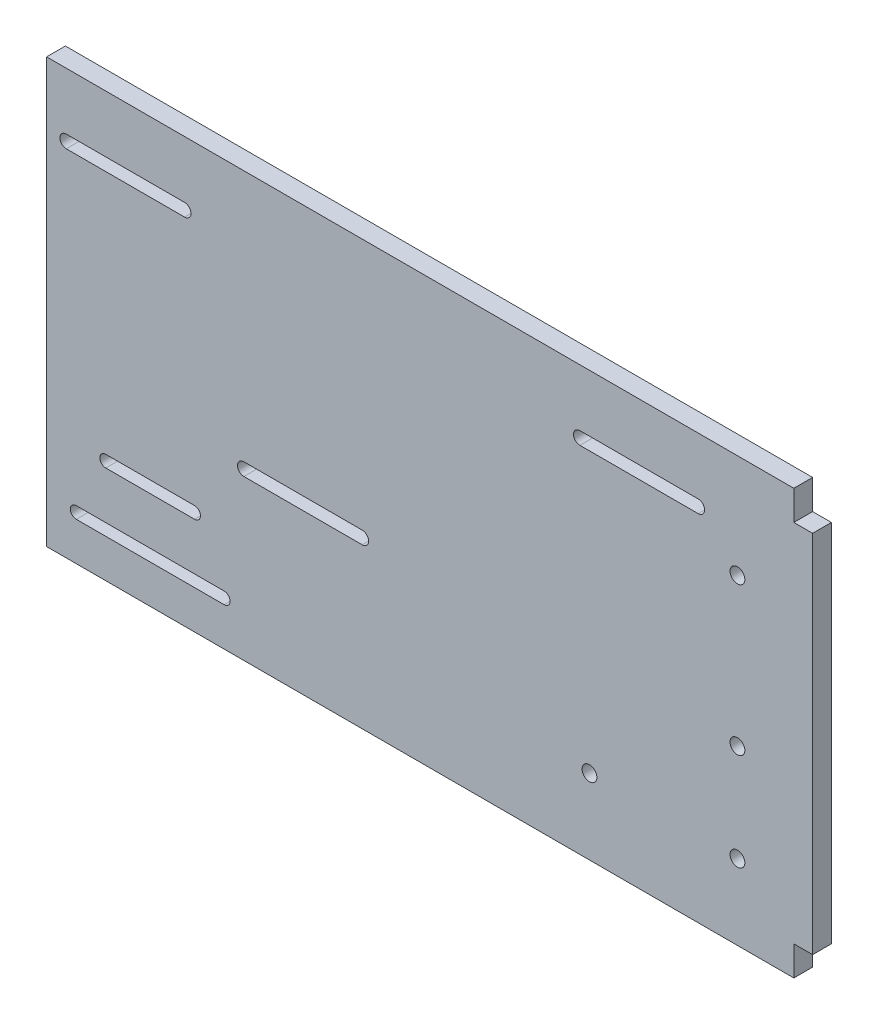
ISO-10303-21;
HEADER;
FILE_DESCRIPTION(('STEP AP214'),'2;1');
FILE_NAME('part.step','',(''),(''),'','','');
FILE_SCHEMA(('AUTOMOTIVE_DESIGN { 1 0 10303 214 1 1 1 1 }'));
ENDSEC;
DATA;
#1=APPLICATION_CONTEXT('core data for automotive mechanical design processes');
#2=APPLICATION_PROTOCOL_DEFINITION('international standard','automotive_design',2000,#1);
#3=PRODUCT_CONTEXT('',#1,'mechanical');
#4=PRODUCT('Part','Part','',(#3));
#5=PRODUCT_RELATED_PRODUCT_CATEGORY('part','',(#4));
#6=PRODUCT_DEFINITION_FORMATION('','',#4);
#7=PRODUCT_DEFINITION_CONTEXT('part definition',#1,'design');
#8=PRODUCT_DEFINITION('design','',#6,#7);
#9=PRODUCT_DEFINITION_SHAPE('','',#8);
#10=(LENGTH_UNIT() NAMED_UNIT(*) SI_UNIT(.MILLI.,.METRE.));
#11=(NAMED_UNIT(*) PLANE_ANGLE_UNIT() SI_UNIT($,.RADIAN.));
#12=(NAMED_UNIT(*) SI_UNIT($,.STERADIAN.) SOLID_ANGLE_UNIT());
#13=UNCERTAINTY_MEASURE_WITH_UNIT(LENGTH_MEASURE(1.E-05),#10,'distance_accuracy_value','');
#14=(GEOMETRIC_REPRESENTATION_CONTEXT(3) GLOBAL_UNCERTAINTY_ASSIGNED_CONTEXT((#13)) GLOBAL_UNIT_ASSIGNED_CONTEXT((#10,
#11,#12)) REPRESENTATION_CONTEXT('',''));
#15=CARTESIAN_POINT('',(0.,0.,0.));
#16=DIRECTION('',(0.,0.,1.));
#17=DIRECTION('',(1.,0.,0.));
#18=AXIS2_PLACEMENT_3D('',#15,#16,#17);
#19=CARTESIAN_POINT('',(0.,0.,6.35));
#20=DIRECTION('',(0.,0.,-1.));
#21=DIRECTION('',(-1.,0.,0.));
#22=AXIS2_PLACEMENT_3D('',#19,#20,#21);
#23=PLANE('',#22);
#24=CARTESIAN_POINT('',(12.0916813878954,-66.3543128520775,6.35));
#25=DIRECTION('',(0.,0.,1.));
#26=DIRECTION('',(-1.,0.,0.));
#27=AXIS2_PLACEMENT_3D('',#24,#25,#26);
#28=CIRCLE('',#27,1.99999999999999);
#29=CARTESIAN_POINT('',(12.0916813878954,-64.3543128520775,6.35));
#30=VERTEX_POINT('',#29);
#31=CARTESIAN_POINT('',(12.0916813878954,-68.3543128520775,6.35));
#32=VERTEX_POINT('',#31);
#33=EDGE_CURVE('E273',#30,#32,#28,.T.);
#34=ORIENTED_EDGE('',*,*,#33,.F.);
#35=DIRECTION('',(-1.,0.,0.));
#36=VECTOR('',#35,1.);
#37=CARTESIAN_POINT('',(12.0916813878954,-64.3543128520775,6.35));
#38=LINE('',#37,#36);
#39=CARTESIAN_POINT('',(42.0916813878954,-64.3543128520775,6.35));
#40=VERTEX_POINT('',#39);
#41=EDGE_CURVE('E284',#40,#30,#38,.T.);
#42=ORIENTED_EDGE('',*,*,#41,.F.);
#43=CARTESIAN_POINT('',(42.0916813878954,-66.3543128520775,6.35));
#44=DIRECTION('',(0.,0.,1.));
#45=DIRECTION('',(1.,0.,0.));
#46=AXIS2_PLACEMENT_3D('',#43,#44,#45);
#47=CIRCLE('',#46,1.99999999999999);
#48=CARTESIAN_POINT('',(42.0916813878954,-68.3543128520775,6.35));
#49=VERTEX_POINT('',#48);
#50=EDGE_CURVE('E280',#49,#40,#47,.T.);
#51=ORIENTED_EDGE('',*,*,#50,.F.);
#52=DIRECTION('',(1.,0.,0.));
#53=VECTOR('',#52,1.);
#54=CARTESIAN_POINT('',(12.0916813878954,-68.3543128520775,6.35));
#55=LINE('',#54,#53);
#56=EDGE_CURVE('E276',#32,#49,#55,.T.);
#57=ORIENTED_EDGE('',*,*,#56,.F.);
#58=EDGE_LOOP('',(#34,#42,#51,#57));
#59=FACE_BOUND('',#58,.T.);
#60=CARTESIAN_POINT('',(225.534917863481,6.96266581231087,6.35));
#61=DIRECTION('',(0.,0.,1.));
#62=DIRECTION('',(1.,0.,0.));
#63=AXIS2_PLACEMENT_3D('',#60,#61,#62);
#64=CIRCLE('',#63,2.5);
#65=CARTESIAN_POINT('',(228.034917863481,6.96266581231087,6.35));
#66=VERTEX_POINT('',#65);
#67=EDGE_CURVE('E375',#66,#66,#64,.T.);
#68=ORIENTED_EDGE('',*,*,#67,.F.);
#69=EDGE_LOOP('',(#68));
#70=FACE_BOUND('',#69,.T.);
#71=CARTESIAN_POINT('',(58.7485992030947,-45.3543128520775,6.35));
#72=DIRECTION('',(0.,0.,1.));
#73=DIRECTION('',(1.,0.,0.));
#74=AXIS2_PLACEMENT_3D('',#71,#72,#73);
#75=CIRCLE('',#74,2.15);
#76=CARTESIAN_POINT('',(58.7485992030947,-43.2043128520775,6.35));
#77=VERTEX_POINT('',#76);
#78=CARTESIAN_POINT('',(58.7485992030947,-47.5043128520775,6.35));
#79=VERTEX_POINT('',#78);
#80=EDGE_CURVE('E383',#77,#79,#75,.T.);
#81=ORIENTED_EDGE('',*,*,#80,.F.);
#82=DIRECTION('',(-1.,0.,0.));
#83=VECTOR('',#82,1.);
#84=CARTESIAN_POINT('',(58.7485992030947,-43.2043128520775,6.35));
#85=LINE('',#84,#83);
#86=CARTESIAN_POINT('',(98.7485992030947,-43.2043128520775,6.35));
#87=VERTEX_POINT('',#86);
#88=EDGE_CURVE('E394',#87,#77,#85,.T.);
#89=ORIENTED_EDGE('',*,*,#88,.F.);
#90=CARTESIAN_POINT('',(98.7485992030947,-45.3543128520775,6.35));
#91=DIRECTION('',(0.,0.,1.));
#92=DIRECTION('',(-1.,0.,0.));
#93=AXIS2_PLACEMENT_3D('',#90,#91,#92);
#94=CIRCLE('',#93,2.15);
#95=CARTESIAN_POINT('',(98.7485992030947,-47.5043128520775,6.35));
#96=VERTEX_POINT('',#95);
#97=EDGE_CURVE('E390',#96,#87,#94,.T.);
#98=ORIENTED_EDGE('',*,*,#97,.F.);
#99=DIRECTION('',(1.,0.,0.));
#100=VECTOR('',#99,1.);
#101=CARTESIAN_POINT('',(58.7485992030947,-47.5043128520775,6.35));
#102=LINE('',#101,#100);
#103=EDGE_CURVE('E386',#79,#96,#102,.T.);
#104=ORIENTED_EDGE('',*,*,#103,.F.);
#105=EDGE_LOOP('',(#81,#89,#98,#104));
#106=FACE_BOUND('',#105,.T.);
#107=CARTESIAN_POINT('',(225.534917863481,-43.0373341876891,6.35));
#108=DIRECTION('',(0.,0.,1.));
#109=DIRECTION('',(1.,0.,0.));
#110=AXIS2_PLACEMENT_3D('',#107,#108,#109);
#111=CIRCLE('',#110,2.5);
#112=CARTESIAN_POINT('',(228.034917863481,-43.0373341876891,6.35));
#113=VERTEX_POINT('',#112);
#114=EDGE_CURVE('E469',#113,#113,#111,.T.);
#115=ORIENTED_EDGE('',*,*,#114,.F.);
#116=EDGE_LOOP('',(#115));
#117=FACE_BOUND('',#116,.T.);
#118=DIRECTION('',(0.,-1.,0.));
#119=VECTOR('',#118,1.);
#120=CARTESIAN_POINT('',(-7.9083186121046,41.9626658123108,6.35));
#121=LINE('',#120,#119);
#122=CARTESIAN_POINT('',(-7.9083186121046,41.9626658123108,6.35));
#123=VERTEX_POINT('',#122);
#124=CARTESIAN_POINT('',(-7.90831861210459,-101.354312852078,6.35));
#125=VERTEX_POINT('',#124);
#126=EDGE_CURVE('E477',#123,#125,#121,.T.);
#127=ORIENTED_EDGE('',*,*,#126,.T.);
#128=DIRECTION('',(1.,0.,0.));
#129=VECTOR('',#128,1.);
#130=CARTESIAN_POINT('',(244.584917863481,-101.354312852078,6.35));
#131=LINE('',#130,#129);
#132=CARTESIAN_POINT('',(244.584917863481,-101.354312852078,6.35));
#133=VERTEX_POINT('',#132);
#134=EDGE_CURVE('E481',#125,#133,#131,.T.);
#135=ORIENTED_EDGE('',*,*,#134,.T.);
#136=DIRECTION('',(0.,1.,0.));
#137=VECTOR('',#136,1.);
#138=CARTESIAN_POINT('',(244.584917863481,-101.354312852078,6.35));
#139=LINE('',#138,#137);
#140=CARTESIAN_POINT('',(244.584917863481,-91.3543128520775,6.35));
#141=VERTEX_POINT('',#140);
#142=EDGE_CURVE('E485',#133,#141,#139,.T.);
#143=ORIENTED_EDGE('',*,*,#142,.T.);
#144=DIRECTION('',(1.,0.,0.));
#145=VECTOR('',#144,1.);
#146=CARTESIAN_POINT('',(250.934917863481,-91.3543128520775,6.35));
#147=LINE('',#146,#145);
#148=CARTESIAN_POINT('',(250.934917863481,-91.3543128520775,6.35));
#149=VERTEX_POINT('',#148);
#150=EDGE_CURVE('E488',#141,#149,#147,.T.);
#151=ORIENTED_EDGE('',*,*,#150,.T.);
#152=DIRECTION('',(0.,1.,0.));
#153=VECTOR('',#152,1.);
#154=CARTESIAN_POINT('',(250.934917863481,31.9626658123109,6.35));
#155=LINE('',#154,#153);
#156=CARTESIAN_POINT('',(250.934917863481,31.9626658123109,6.35));
#157=VERTEX_POINT('',#156);
#158=EDGE_CURVE('E491',#149,#157,#155,.T.);
#159=ORIENTED_EDGE('',*,*,#158,.T.);
#160=DIRECTION('',(-1.,0.,0.));
#161=VECTOR('',#160,1.);
#162=CARTESIAN_POINT('',(250.934917863481,31.9626658123109,6.35));
#163=LINE('',#162,#161);
#164=CARTESIAN_POINT('',(244.584917863481,31.9626658123109,6.35));
#165=VERTEX_POINT('',#164);
#166=EDGE_CURVE('E494',#157,#165,#163,.T.);
#167=ORIENTED_EDGE('',*,*,#166,.T.);
#168=DIRECTION('',(0.,1.,0.));
#169=VECTOR('',#168,1.);
#170=CARTESIAN_POINT('',(244.584917863481,41.9626658123109,6.35));
#171=LINE('',#170,#169);
#172=CARTESIAN_POINT('',(244.584917863481,41.9626658123109,6.35));
#173=VERTEX_POINT('',#172);
#174=EDGE_CURVE('E497',#165,#173,#171,.T.);
#175=ORIENTED_EDGE('',*,*,#174,.T.);
#176=DIRECTION('',(-1.,0.,0.));
#177=VECTOR('',#176,1.);
#178=CARTESIAN_POINT('',(244.584917863481,41.9626658123109,6.35));
#179=LINE('',#178,#177);
#180=EDGE_CURVE('E500',#173,#123,#179,.T.);
#181=ORIENTED_EDGE('',*,*,#180,.T.);
#182=EDGE_LOOP('',(#127,#135,#143,#151,#159,#167,#175,#181));
#183=FACE_BOUND('',#182,.T.);
#184=CARTESIAN_POINT('',(-1.26140079691419,20.5356871479202,6.35));
#185=DIRECTION('',(0.,0.,1.));
#186=DIRECTION('',(1.,0.,0.));
#187=AXIS2_PLACEMENT_3D('',#184,#185,#186);
#188=CIRCLE('',#187,2.15);
#189=CARTESIAN_POINT('',(-1.26140079691419,22.6856871479202,6.35));
#190=VERTEX_POINT('',#189);
#191=CARTESIAN_POINT('',(-1.26140079691419,18.3856871479202,6.35));
#192=VERTEX_POINT('',#191);
#193=EDGE_CURVE('E426',#190,#192,#188,.T.);
#194=ORIENTED_EDGE('',*,*,#193,.F.);
#195=DIRECTION('',(-1.,0.,0.));
#196=VECTOR('',#195,1.);
#197=CARTESIAN_POINT('',(-1.26140079691419,22.6856871479202,6.35));
#198=LINE('',#197,#196);
#199=CARTESIAN_POINT('',(38.7385992030858,22.6856871479202,6.35));
#200=VERTEX_POINT('',#199);
#201=EDGE_CURVE('E437',#200,#190,#198,.T.);
#202=ORIENTED_EDGE('',*,*,#201,.F.);
#203=CARTESIAN_POINT('',(38.7385992030858,20.5356871479202,6.35));
#204=DIRECTION('',(0.,0.,1.));
#205=DIRECTION('',(-1.,0.,0.));
#206=AXIS2_PLACEMENT_3D('',#203,#204,#205);
#207=CIRCLE('',#206,2.15);
#208=CARTESIAN_POINT('',(38.7385992030858,18.3856871479202,6.35));
#209=VERTEX_POINT('',#208);
#210=EDGE_CURVE('E433',#209,#200,#207,.T.);
#211=ORIENTED_EDGE('',*,*,#210,.F.);
#212=DIRECTION('',(1.,0.,0.));
#213=VECTOR('',#212,1.);
#214=CARTESIAN_POINT('',(-1.26140079691419,18.3856871479202,6.35));
#215=LINE('',#214,#213);
#216=EDGE_CURVE('E429',#192,#209,#215,.T.);
#217=ORIENTED_EDGE('',*,*,#216,.F.);
#218=EDGE_LOOP('',(#194,#202,#211,#217));
#219=FACE_BOUND('',#218,.T.);
#220=CARTESIAN_POINT('',(172.288599203087,20.5356871479202,6.35));
#221=DIRECTION('',(0.,0.,1.));
#222=DIRECTION('',(1.,0.,0.));
#223=AXIS2_PLACEMENT_3D('',#220,#221,#222);
#224=CIRCLE('',#223,2.15000000000002);
#225=CARTESIAN_POINT('',(172.288599203087,22.6856871479202,6.35));
#226=VERTEX_POINT('',#225);
#227=CARTESIAN_POINT('',(172.288599203087,18.3856871479202,6.35));
#228=VERTEX_POINT('',#227);
#229=EDGE_CURVE('E332',#226,#228,#224,.T.);
#230=ORIENTED_EDGE('',*,*,#229,.F.);
#231=DIRECTION('',(-1.,0.,0.));
#232=VECTOR('',#231,1.);
#233=CARTESIAN_POINT('',(172.288599203087,22.6856871479202,6.35));
#234=LINE('',#233,#232);
#235=CARTESIAN_POINT('',(212.288599203087,22.6856871479202,6.35));
#236=VERTEX_POINT('',#235);
#237=EDGE_CURVE('E343',#236,#226,#234,.T.);
#238=ORIENTED_EDGE('',*,*,#237,.F.);
#239=CARTESIAN_POINT('',(212.288599203087,20.5356871479202,6.35));
#240=DIRECTION('',(0.,0.,1.));
#241=DIRECTION('',(-1.,0.,0.));
#242=AXIS2_PLACEMENT_3D('',#239,#240,#241);
#243=CIRCLE('',#242,2.15000000000002);
#244=CARTESIAN_POINT('',(212.288599203087,18.3856871479202,6.35));
#245=VERTEX_POINT('',#244);
#246=EDGE_CURVE('E339',#245,#236,#243,.T.);
#247=ORIENTED_EDGE('',*,*,#246,.F.);
#248=DIRECTION('',(1.,0.,0.));
#249=VECTOR('',#248,1.);
#250=CARTESIAN_POINT('',(172.288599203087,18.3856871479202,6.35));
#251=LINE('',#250,#249);
#252=EDGE_CURVE('E335',#228,#245,#251,.T.);
#253=ORIENTED_EDGE('',*,*,#252,.F.);
#254=EDGE_LOOP('',(#230,#238,#247,#253));
#255=FACE_BOUND('',#254,.T.);
#256=CARTESIAN_POINT('',(225.534917863481,-75.9543128520775,6.35));
#257=DIRECTION('',(0.,0.,1.));
#258=DIRECTION('',(1.,0.,0.));
#259=AXIS2_PLACEMENT_3D('',#256,#257,#258);
#260=CIRCLE('',#259,2.5);
#261=CARTESIAN_POINT('',(228.034917863481,-75.9543128520775,6.35));
#262=VERTEX_POINT('',#261);
#263=EDGE_CURVE('E324',#262,#262,#260,.T.);
#264=ORIENTED_EDGE('',*,*,#263,.F.);
#265=EDGE_LOOP('',(#264));
#266=FACE_BOUND('',#265,.T.);
#267=CARTESIAN_POINT('',(175.534917863481,-75.9543128520775,6.35));
#268=DIRECTION('',(0.,0.,1.));
#269=DIRECTION('',(1.,0.,0.));
#270=AXIS2_PLACEMENT_3D('',#267,#268,#269);
#271=CIRCLE('',#270,2.5);
#272=CARTESIAN_POINT('',(178.034917863481,-75.9543128520775,6.35));
#273=VERTEX_POINT('',#272);
#274=EDGE_CURVE('E316',#273,#273,#271,.T.);
#275=ORIENTED_EDGE('',*,*,#274,.F.);
#276=EDGE_LOOP('',(#275));
#277=FACE_BOUND('',#276,.T.);
#278=CARTESIAN_POINT('',(2.09168138789541,-86.3543128520775,6.35));
#279=DIRECTION('',(0.,0.,1.));
#280=DIRECTION('',(1.,0.,0.));
#281=AXIS2_PLACEMENT_3D('',#278,#279,#280);
#282=CIRCLE('',#281,2.);
#283=CARTESIAN_POINT('',(2.09168138789541,-84.3543128520775,6.35));
#284=VERTEX_POINT('',#283);
#285=CARTESIAN_POINT('',(2.09168138789541,-88.3543128520775,6.35));
#286=VERTEX_POINT('',#285);
#287=EDGE_CURVE('E225',#284,#286,#282,.T.);
#288=ORIENTED_EDGE('',*,*,#287,.F.);
#289=DIRECTION('',(-1.,0.,0.));
#290=VECTOR('',#289,1.);
#291=CARTESIAN_POINT('',(2.09168138789541,-84.3543128520775,6.35));
#292=LINE('',#291,#290);
#293=CARTESIAN_POINT('',(52.0916813878954,-84.3543128520775,6.35));
#294=VERTEX_POINT('',#293);
#295=EDGE_CURVE('E251',#294,#284,#292,.T.);
#296=ORIENTED_EDGE('',*,*,#295,.F.);
#297=CARTESIAN_POINT('',(52.0916813878954,-86.3543128520775,6.35));
#298=DIRECTION('',(0.,0.,1.));
#299=DIRECTION('',(1.,0.,0.));
#300=AXIS2_PLACEMENT_3D('',#297,#298,#299);
#301=CIRCLE('',#300,2.);
#302=CARTESIAN_POINT('',(52.0916813878954,-88.3543128520775,6.35));
#303=VERTEX_POINT('',#302);
#304=EDGE_CURVE('E247',#303,#294,#301,.T.);
#305=ORIENTED_EDGE('',*,*,#304,.F.);
#306=DIRECTION('',(1.,0.,0.));
#307=VECTOR('',#306,1.);
#308=CARTESIAN_POINT('',(2.09168138789541,-88.3543128520775,6.35));
#309=LINE('',#308,#307);
#310=EDGE_CURVE('E234',#286,#303,#309,.T.);
#311=ORIENTED_EDGE('',*,*,#310,.F.);
#312=EDGE_LOOP('',(#288,#296,#305,#311));
#313=FACE_BOUND('',#312,.T.);
#314=ADVANCED_FACE('F39',(#59,#70,#106,#117,#183,#219,#255,#266,#277,#313),#23,.F.);
#315=CARTESIAN_POINT('',(0.,0.,0.));
#316=DIRECTION('',(0.,0.,-1.));
#317=DIRECTION('',(-1.,0.,0.));
#318=AXIS2_PLACEMENT_3D('',#315,#316,#317);
#319=PLANE('',#318);
#320=CARTESIAN_POINT('',(225.534917863481,-75.9543128520775,0.));
#321=DIRECTION('',(0.,0.,1.));
#322=DIRECTION('',(1.,0.,0.));
#323=AXIS2_PLACEMENT_3D('',#320,#321,#322);
#324=CIRCLE('',#323,2.5);
#325=CARTESIAN_POINT('',(228.034917863481,-75.9543128520775,0.));
#326=VERTEX_POINT('',#325);
#327=EDGE_CURVE('E320',#326,#326,#324,.T.);
#328=ORIENTED_EDGE('',*,*,#327,.T.);
#329=EDGE_LOOP('',(#328));
#330=FACE_BOUND('',#329,.T.);
#331=DIRECTION('',(-1.,0.,0.));
#332=VECTOR('',#331,1.);
#333=CARTESIAN_POINT('',(58.7485992030947,-43.2043128520775,0.));
#334=LINE('',#333,#332);
#335=CARTESIAN_POINT('',(98.7485992030947,-43.2043128520775,0.));
#336=VERTEX_POINT('',#335);
#337=CARTESIAN_POINT('',(58.7485992030947,-43.2043128520775,0.));
#338=VERTEX_POINT('',#337);
#339=EDGE_CURVE('E387',#336,#338,#334,.T.);
#340=ORIENTED_EDGE('',*,*,#339,.T.);
#341=CARTESIAN_POINT('',(58.7485992030947,-45.3543128520775,0.));
#342=DIRECTION('',(0.,0.,1.));
#343=DIRECTION('',(1.,0.,0.));
#344=AXIS2_PLACEMENT_3D('',#341,#342,#343);
#345=CIRCLE('',#344,2.15);
#346=CARTESIAN_POINT('',(58.7485992030947,-47.5043128520775,0.));
#347=VERTEX_POINT('',#346);
#348=EDGE_CURVE('E379',#338,#347,#345,.T.);
#349=ORIENTED_EDGE('',*,*,#348,.T.);
#350=DIRECTION('',(1.,0.,0.));
#351=VECTOR('',#350,1.);
#352=CARTESIAN_POINT('',(58.7485992030947,-47.5043128520775,0.));
#353=LINE('',#352,#351);
#354=CARTESIAN_POINT('',(98.7485992030947,-47.5043128520775,0.));
#355=VERTEX_POINT('',#354);
#356=EDGE_CURVE('E401',#347,#355,#353,.T.);
#357=ORIENTED_EDGE('',*,*,#356,.T.);
#358=CARTESIAN_POINT('',(98.7485992030947,-45.3543128520775,0.));
#359=DIRECTION('',(0.,0.,1.));
#360=DIRECTION('',(-1.,0.,0.));
#361=AXIS2_PLACEMENT_3D('',#358,#359,#360);
#362=CIRCLE('',#361,2.15);
#363=EDGE_CURVE('E405',#355,#336,#362,.T.);
#364=ORIENTED_EDGE('',*,*,#363,.T.);
#365=EDGE_LOOP('',(#340,#349,#357,#364));
#366=FACE_BOUND('',#365,.T.);
#367=DIRECTION('',(-1.,0.,0.));
#368=VECTOR('',#367,1.);
#369=CARTESIAN_POINT('',(-1.26140079691419,22.6856871479202,0.));
#370=LINE('',#369,#368);
#371=CARTESIAN_POINT('',(38.7385992030858,22.6856871479202,0.));
#372=VERTEX_POINT('',#371);
#373=CARTESIAN_POINT('',(-1.26140079691419,22.6856871479202,0.));
#374=VERTEX_POINT('',#373);
#375=EDGE_CURVE('E430',#372,#374,#370,.T.);
#376=ORIENTED_EDGE('',*,*,#375,.T.);
#377=CARTESIAN_POINT('',(-1.26140079691419,20.5356871479202,0.));
#378=DIRECTION('',(0.,0.,1.));
#379=DIRECTION('',(1.,0.,0.));
#380=AXIS2_PLACEMENT_3D('',#377,#378,#379);
#381=CIRCLE('',#380,2.15);
#382=CARTESIAN_POINT('',(-1.26140079691419,18.3856871479202,0.));
#383=VERTEX_POINT('',#382);
#384=EDGE_CURVE('E425',#374,#383,#381,.T.);
#385=ORIENTED_EDGE('',*,*,#384,.T.);
#386=DIRECTION('',(1.,0.,0.));
#387=VECTOR('',#386,1.);
#388=CARTESIAN_POINT('',(-1.26140079691419,18.3856871479202,0.));
#389=LINE('',#388,#387);
#390=CARTESIAN_POINT('',(38.7385992030858,18.3856871479202,0.));
#391=VERTEX_POINT('',#390);
#392=EDGE_CURVE('E444',#383,#391,#389,.T.);
#393=ORIENTED_EDGE('',*,*,#392,.T.);
#394=CARTESIAN_POINT('',(38.7385992030858,20.5356871479202,0.));
#395=DIRECTION('',(0.,0.,1.));
#396=DIRECTION('',(-1.,0.,0.));
#397=AXIS2_PLACEMENT_3D('',#394,#395,#396);
#398=CIRCLE('',#397,2.15);
#399=EDGE_CURVE('E448',#391,#372,#398,.T.);
#400=ORIENTED_EDGE('',*,*,#399,.T.);
#401=EDGE_LOOP('',(#376,#385,#393,#400));
#402=FACE_BOUND('',#401,.T.);
#403=CARTESIAN_POINT('',(225.534917863481,-43.0373341876891,0.));
#404=DIRECTION('',(0.,0.,1.));
#405=DIRECTION('',(1.,0.,0.));
#406=AXIS2_PLACEMENT_3D('',#403,#404,#405);
#407=CIRCLE('',#406,2.5);
#408=CARTESIAN_POINT('',(228.034917863481,-43.0373341876891,0.));
#409=VERTEX_POINT('',#408);
#410=EDGE_CURVE('E468',#409,#409,#407,.T.);
#411=ORIENTED_EDGE('',*,*,#410,.T.);
#412=EDGE_LOOP('',(#411));
#413=FACE_BOUND('',#412,.T.);
#414=DIRECTION('',(0.,-1.,0.));
#415=VECTOR('',#414,1.);
#416=CARTESIAN_POINT('',(-7.9083186121046,41.9626658123108,0.));
#417=LINE('',#416,#415);
#418=CARTESIAN_POINT('',(-7.9083186121046,41.9626658123108,0.));
#419=VERTEX_POINT('',#418);
#420=CARTESIAN_POINT('',(-7.90831861210459,-101.354312852078,0.));
#421=VERTEX_POINT('',#420);
#422=EDGE_CURVE('E473',#419,#421,#417,.T.);
#423=ORIENTED_EDGE('',*,*,#422,.F.);
#424=DIRECTION('',(-1.,0.,0.));
#425=VECTOR('',#424,1.);
#426=CARTESIAN_POINT('',(244.584917863481,41.9626658123109,0.));
#427=LINE('',#426,#425);
#428=CARTESIAN_POINT('',(244.584917863481,41.9626658123109,0.));
#429=VERTEX_POINT('',#428);
#430=EDGE_CURVE('E482',#429,#419,#427,.T.);
#431=ORIENTED_EDGE('',*,*,#430,.F.);
#432=DIRECTION('',(0.,1.,0.));
#433=VECTOR('',#432,1.);
#434=CARTESIAN_POINT('',(244.584917863481,41.9626658123109,0.));
#435=LINE('',#434,#433);
#436=CARTESIAN_POINT('',(244.584917863481,31.9626658123109,0.));
#437=VERTEX_POINT('',#436);
#438=EDGE_CURVE('E522',#437,#429,#435,.T.);
#439=ORIENTED_EDGE('',*,*,#438,.F.);
#440=DIRECTION('',(-1.,0.,0.));
#441=VECTOR('',#440,1.);
#442=CARTESIAN_POINT('',(250.934917863481,31.9626658123109,0.));
#443=LINE('',#442,#441);
#444=CARTESIAN_POINT('',(250.934917863481,31.9626658123109,0.));
#445=VERTEX_POINT('',#444);
#446=EDGE_CURVE('E519',#445,#437,#443,.T.);
#447=ORIENTED_EDGE('',*,*,#446,.F.);
#448=DIRECTION('',(0.,1.,0.));
#449=VECTOR('',#448,1.);
#450=CARTESIAN_POINT('',(250.934917863481,31.9626658123109,0.));
#451=LINE('',#450,#449);
#452=CARTESIAN_POINT('',(250.934917863481,-91.3543128520775,0.));
#453=VERTEX_POINT('',#452);
#454=EDGE_CURVE('E516',#453,#445,#451,.T.);
#455=ORIENTED_EDGE('',*,*,#454,.F.);
#456=DIRECTION('',(1.,0.,0.));
#457=VECTOR('',#456,1.);
#458=CARTESIAN_POINT('',(250.934917863481,-91.3543128520775,0.));
#459=LINE('',#458,#457);
#460=CARTESIAN_POINT('',(244.584917863481,-91.3543128520775,0.));
#461=VERTEX_POINT('',#460);
#462=EDGE_CURVE('E513',#461,#453,#459,.T.);
#463=ORIENTED_EDGE('',*,*,#462,.F.);
#464=DIRECTION('',(0.,1.,0.));
#465=VECTOR('',#464,1.);
#466=CARTESIAN_POINT('',(244.584917863481,-101.354312852078,0.));
#467=LINE('',#466,#465);
#468=CARTESIAN_POINT('',(244.584917863481,-101.354312852078,0.));
#469=VERTEX_POINT('',#468);
#470=EDGE_CURVE('E510',#469,#461,#467,.T.);
#471=ORIENTED_EDGE('',*,*,#470,.F.);
#472=DIRECTION('',(1.,0.,0.));
#473=VECTOR('',#472,1.);
#474=CARTESIAN_POINT('',(244.584917863481,-101.354312852078,0.));
#475=LINE('',#474,#473);
#476=EDGE_CURVE('E507',#421,#469,#475,.T.);
#477=ORIENTED_EDGE('',*,*,#476,.F.);
#478=EDGE_LOOP('',(#423,#431,#439,#447,#455,#463,#471,#477));
#479=FACE_BOUND('',#478,.T.);
#480=CARTESIAN_POINT('',(225.534917863481,6.96266581231087,0.));
#481=DIRECTION('',(0.,0.,1.));
#482=DIRECTION('',(1.,0.,0.));
#483=AXIS2_PLACEMENT_3D('',#480,#481,#482);
#484=CIRCLE('',#483,2.5);
#485=CARTESIAN_POINT('',(228.034917863481,6.96266581231087,0.));
#486=VERTEX_POINT('',#485);
#487=EDGE_CURVE('E374',#486,#486,#484,.T.);
#488=ORIENTED_EDGE('',*,*,#487,.T.);
#489=EDGE_LOOP('',(#488));
#490=FACE_BOUND('',#489,.T.);
#491=DIRECTION('',(-1.,0.,0.));
#492=VECTOR('',#491,1.);
#493=CARTESIAN_POINT('',(172.288599203087,22.6856871479202,0.));
#494=LINE('',#493,#492);
#495=CARTESIAN_POINT('',(212.288599203087,22.6856871479202,0.));
#496=VERTEX_POINT('',#495);
#497=CARTESIAN_POINT('',(172.288599203087,22.6856871479202,0.));
#498=VERTEX_POINT('',#497);
#499=EDGE_CURVE('E336',#496,#498,#494,.T.);
#500=ORIENTED_EDGE('',*,*,#499,.T.);
#501=CARTESIAN_POINT('',(172.288599203087,20.5356871479202,0.));
#502=DIRECTION('',(0.,0.,1.));
#503=DIRECTION('',(1.,0.,0.));
#504=AXIS2_PLACEMENT_3D('',#501,#502,#503);
#505=CIRCLE('',#504,2.15000000000002);
#506=CARTESIAN_POINT('',(172.288599203087,18.3856871479202,0.));
#507=VERTEX_POINT('',#506);
#508=EDGE_CURVE('E328',#498,#507,#505,.T.);
#509=ORIENTED_EDGE('',*,*,#508,.T.);
#510=DIRECTION('',(1.,0.,0.));
#511=VECTOR('',#510,1.);
#512=CARTESIAN_POINT('',(172.288599203087,18.3856871479202,0.));
#513=LINE('',#512,#511);
#514=CARTESIAN_POINT('',(212.288599203087,18.3856871479202,0.));
#515=VERTEX_POINT('',#514);
#516=EDGE_CURVE('E350',#507,#515,#513,.T.);
#517=ORIENTED_EDGE('',*,*,#516,.T.);
#518=CARTESIAN_POINT('',(212.288599203087,20.5356871479202,0.));
#519=DIRECTION('',(0.,0.,1.));
#520=DIRECTION('',(-1.,0.,0.));
#521=AXIS2_PLACEMENT_3D('',#518,#519,#520);
#522=CIRCLE('',#521,2.15000000000002);
#523=EDGE_CURVE('E354',#515,#496,#522,.T.);
#524=ORIENTED_EDGE('',*,*,#523,.T.);
#525=EDGE_LOOP('',(#500,#509,#517,#524));
#526=FACE_BOUND('',#525,.T.);
#527=CARTESIAN_POINT('',(175.534917863481,-75.9543128520775,0.));
#528=DIRECTION('',(0.,0.,1.));
#529=DIRECTION('',(1.,0.,0.));
#530=AXIS2_PLACEMENT_3D('',#527,#528,#529);
#531=CIRCLE('',#530,2.5);
#532=CARTESIAN_POINT('',(178.034917863481,-75.9543128520775,0.));
#533=VERTEX_POINT('',#532);
#534=EDGE_CURVE('E315',#533,#533,#531,.T.);
#535=ORIENTED_EDGE('',*,*,#534,.T.);
#536=EDGE_LOOP('',(#535));
#537=FACE_BOUND('',#536,.T.);
#538=DIRECTION('',(-1.,0.,0.));
#539=VECTOR('',#538,1.);
#540=CARTESIAN_POINT('',(12.0916813878954,-64.3543128520775,0.));
#541=LINE('',#540,#539);
#542=CARTESIAN_POINT('',(42.0916813878954,-64.3543128520775,0.));
#543=VERTEX_POINT('',#542);
#544=CARTESIAN_POINT('',(12.0916813878954,-64.3543128520775,0.));
#545=VERTEX_POINT('',#544);
#546=EDGE_CURVE('E277',#543,#545,#541,.T.);
#547=ORIENTED_EDGE('',*,*,#546,.T.);
#548=CARTESIAN_POINT('',(12.0916813878954,-66.3543128520775,0.));
#549=DIRECTION('',(0.,0.,1.));
#550=DIRECTION('',(-1.,0.,0.));
#551=AXIS2_PLACEMENT_3D('',#548,#549,#550);
#552=CIRCLE('',#551,1.99999999999999);
#553=CARTESIAN_POINT('',(12.0916813878954,-68.3543128520775,0.));
#554=VERTEX_POINT('',#553);
#555=EDGE_CURVE('E243',#545,#554,#552,.T.);
#556=ORIENTED_EDGE('',*,*,#555,.T.);
#557=DIRECTION('',(1.,0.,0.));
#558=VECTOR('',#557,1.);
#559=CARTESIAN_POINT('',(12.0916813878954,-68.3543128520775,0.));
#560=LINE('',#559,#558);
#561=CARTESIAN_POINT('',(42.0916813878954,-68.3543128520775,0.));
#562=VERTEX_POINT('',#561);
#563=EDGE_CURVE('E291',#554,#562,#560,.T.);
#564=ORIENTED_EDGE('',*,*,#563,.T.);
#565=CARTESIAN_POINT('',(42.0916813878954,-66.3543128520775,0.));
#566=DIRECTION('',(0.,0.,1.));
#567=DIRECTION('',(1.,0.,0.));
#568=AXIS2_PLACEMENT_3D('',#565,#566,#567);
#569=CIRCLE('',#568,1.99999999999999);
#570=EDGE_CURVE('E295',#562,#543,#569,.T.);
#571=ORIENTED_EDGE('',*,*,#570,.T.);
#572=EDGE_LOOP('',(#547,#556,#564,#571));
#573=FACE_BOUND('',#572,.T.);
#574=DIRECTION('',(-1.,0.,0.));
#575=VECTOR('',#574,1.);
#576=CARTESIAN_POINT('',(2.09168138789541,-84.3543128520775,0.));
#577=LINE('',#576,#575);
#578=CARTESIAN_POINT('',(52.0916813878954,-84.3543128520775,0.));
#579=VERTEX_POINT('',#578);
#580=CARTESIAN_POINT('',(2.09168138789541,-84.3543128520775,0.));
#581=VERTEX_POINT('',#580);
#582=EDGE_CURVE('E235',#579,#581,#577,.T.);
#583=ORIENTED_EDGE('',*,*,#582,.T.);
#584=CARTESIAN_POINT('',(2.09168138789541,-86.3543128520775,0.));
#585=DIRECTION('',(0.,0.,1.));
#586=DIRECTION('',(1.,0.,0.));
#587=AXIS2_PLACEMENT_3D('',#584,#585,#586);
#588=CIRCLE('',#587,2.);
#589=CARTESIAN_POINT('',(2.09168138789541,-88.3543128520775,0.));
#590=VERTEX_POINT('',#589);
#591=EDGE_CURVE('E63',#581,#590,#588,.T.);
#592=ORIENTED_EDGE('',*,*,#591,.T.);
#593=DIRECTION('',(1.,0.,0.));
#594=VECTOR('',#593,1.);
#595=CARTESIAN_POINT('',(2.09168138789541,-88.3543128520775,0.));
#596=LINE('',#595,#594);
#597=CARTESIAN_POINT('',(52.0916813878954,-88.3543128520775,0.));
#598=VERTEX_POINT('',#597);
#599=EDGE_CURVE('E241',#590,#598,#596,.T.);
#600=ORIENTED_EDGE('',*,*,#599,.T.);
#601=CARTESIAN_POINT('',(52.0916813878954,-86.3543128520775,0.));
#602=DIRECTION('',(0.,0.,1.));
#603=DIRECTION('',(1.,0.,0.));
#604=AXIS2_PLACEMENT_3D('',#601,#602,#603);
#605=CIRCLE('',#604,2.);
#606=EDGE_CURVE('E260',#598,#579,#605,.T.);
#607=ORIENTED_EDGE('',*,*,#606,.T.);
#608=EDGE_LOOP('',(#583,#592,#600,#607));
#609=FACE_BOUND('',#608,.T.);
#610=ADVANCED_FACE('F561',(#330,#366,#402,#413,#479,#490,#526,#537,#573,#609),#319,.T.);
#611=CARTESIAN_POINT('',(-7.9083186121046,41.9626658123108,6.35));
#612=DIRECTION('',(1.,0.,0.));
#613=DIRECTION('',(0.,1.,0.));
#614=AXIS2_PLACEMENT_3D('',#611,#612,#613);
#615=PLANE('',#614);
#616=ORIENTED_EDGE('',*,*,#422,.T.);
#617=DIRECTION('',(0.,0.,-1.));
#618=VECTOR('',#617,1.);
#619=CARTESIAN_POINT('',(-7.90831861210459,-101.354312852078,6.35));
#620=LINE('',#619,#618);
#621=EDGE_CURVE('E11',#125,#421,#620,.T.);
#622=ORIENTED_EDGE('',*,*,#621,.F.);
#623=ORIENTED_EDGE('',*,*,#126,.F.);
#624=DIRECTION('',(0.,0.,-1.));
#625=VECTOR('',#624,1.);
#626=CARTESIAN_POINT('',(-7.9083186121046,41.9626658123108,6.35));
#627=LINE('',#626,#625);
#628=EDGE_CURVE('E503',#123,#419,#627,.T.);
#629=ORIENTED_EDGE('',*,*,#628,.T.);
#630=EDGE_LOOP('',(#616,#622,#623,#629));
#631=FACE_BOUND('',#630,.T.);
#632=ADVANCED_FACE('F41',(#631),#615,.F.);
#633=CARTESIAN_POINT('',(244.584917863481,-101.354312852078,6.35));
#634=DIRECTION('',(0.,1.,0.));
#635=DIRECTION('',(-1.,0.,0.));
#636=AXIS2_PLACEMENT_3D('',#633,#634,#635);
#637=PLANE('',#636);
#638=ORIENTED_EDGE('',*,*,#476,.T.);
#639=DIRECTION('',(0.,0.,-1.));
#640=VECTOR('',#639,1.);
#641=CARTESIAN_POINT('',(244.584917863481,-101.354312852078,6.35));
#642=LINE('',#641,#640);
#643=EDGE_CURVE('E48',#133,#469,#642,.T.);
#644=ORIENTED_EDGE('',*,*,#643,.F.);
#645=ORIENTED_EDGE('',*,*,#134,.F.);
#646=ORIENTED_EDGE('',*,*,#621,.T.);
#647=EDGE_LOOP('',(#638,#644,#645,#646));
#648=FACE_BOUND('',#647,.T.);
#649=ADVANCED_FACE('F579',(#648),#637,.F.);
#650=CARTESIAN_POINT('',(244.584917863481,-101.354312852078,6.35));
#651=DIRECTION('',(-1.,0.,0.));
#652=DIRECTION('',(0.,0.,1.));
#653=AXIS2_PLACEMENT_3D('',#650,#651,#652);
#654=PLANE('',#653);
#655=ORIENTED_EDGE('',*,*,#470,.T.);
#656=DIRECTION('',(0.,0.,-1.));
#657=VECTOR('',#656,1.);
#658=CARTESIAN_POINT('',(244.584917863481,-91.3543128520775,6.35));
#659=LINE('',#658,#657);
#660=EDGE_CURVE('E546',#141,#461,#659,.T.);
#661=ORIENTED_EDGE('',*,*,#660,.F.);
#662=ORIENTED_EDGE('',*,*,#142,.F.);
#663=ORIENTED_EDGE('',*,*,#643,.T.);
#664=EDGE_LOOP('',(#655,#661,#662,#663));
#665=FACE_BOUND('',#664,.T.);
#666=ADVANCED_FACE('F555',(#665),#654,.F.);
#667=CARTESIAN_POINT('',(250.934917863481,-91.3543128520775,6.35));
#668=DIRECTION('',(0.,1.,0.));
#669=DIRECTION('',(0.,0.,1.));
#670=AXIS2_PLACEMENT_3D('',#667,#668,#669);
#671=PLANE('',#670);
#672=ORIENTED_EDGE('',*,*,#462,.T.);
#673=DIRECTION('',(0.,0.,-1.));
#674=VECTOR('',#673,1.);
#675=CARTESIAN_POINT('',(250.934917863481,-91.3543128520775,6.35));
#676=LINE('',#675,#674);
#677=EDGE_CURVE('E542',#149,#453,#676,.T.);
#678=ORIENTED_EDGE('',*,*,#677,.F.);
#679=ORIENTED_EDGE('',*,*,#150,.F.);
#680=ORIENTED_EDGE('',*,*,#660,.T.);
#681=EDGE_LOOP('',(#672,#678,#679,#680));
#682=FACE_BOUND('',#681,.T.);
#683=ADVANCED_FACE('F567',(#682),#671,.F.);
#684=CARTESIAN_POINT('',(250.934917863481,31.9626658123109,6.35));
#685=DIRECTION('',(-1.,0.,0.));
#686=DIRECTION('',(0.,0.,1.));
#687=AXIS2_PLACEMENT_3D('',#684,#685,#686);
#688=PLANE('',#687);
#689=ORIENTED_EDGE('',*,*,#454,.T.);
#690=DIRECTION('',(0.,0.,-1.));
#691=VECTOR('',#690,1.);
#692=CARTESIAN_POINT('',(250.934917863481,31.9626658123109,6.35));
#693=LINE('',#692,#691);
#694=EDGE_CURVE('E538',#157,#445,#693,.T.);
#695=ORIENTED_EDGE('',*,*,#694,.F.);
#696=ORIENTED_EDGE('',*,*,#158,.F.);
#697=ORIENTED_EDGE('',*,*,#677,.T.);
#698=EDGE_LOOP('',(#689,#695,#696,#697));
#699=FACE_BOUND('',#698,.T.);
#700=ADVANCED_FACE('F571',(#699),#688,.F.);
#701=CARTESIAN_POINT('',(250.934917863481,31.9626658123109,6.35));
#702=DIRECTION('',(0.,-1.,0.));
#703=DIRECTION('',(0.,0.,-1.));
#704=AXIS2_PLACEMENT_3D('',#701,#702,#703);
#705=PLANE('',#704);
#706=ORIENTED_EDGE('',*,*,#446,.T.);
#707=DIRECTION('',(0.,0.,-1.));
#708=VECTOR('',#707,1.);
#709=CARTESIAN_POINT('',(244.584917863481,31.9626658123109,6.35));
#710=LINE('',#709,#708);
#711=EDGE_CURVE('E534',#165,#437,#710,.T.);
#712=ORIENTED_EDGE('',*,*,#711,.F.);
#713=ORIENTED_EDGE('',*,*,#166,.F.);
#714=ORIENTED_EDGE('',*,*,#694,.T.);
#715=EDGE_LOOP('',(#706,#712,#713,#714));
#716=FACE_BOUND('',#715,.T.);
#717=ADVANCED_FACE('F592',(#716),#705,.F.);
#718=CARTESIAN_POINT('',(244.584917863481,41.9626658123109,6.35));
#719=DIRECTION('',(-1.,0.,0.));
#720=DIRECTION('',(0.,0.,1.));
#721=AXIS2_PLACEMENT_3D('',#718,#719,#720);
#722=PLANE('',#721);
#723=ORIENTED_EDGE('',*,*,#438,.T.);
#724=DIRECTION('',(0.,0.,-1.));
#725=VECTOR('',#724,1.);
#726=CARTESIAN_POINT('',(244.584917863481,41.9626658123109,6.35));
#727=LINE('',#726,#725);
#728=EDGE_CURVE('E530',#173,#429,#727,.T.);
#729=ORIENTED_EDGE('',*,*,#728,.F.);
#730=ORIENTED_EDGE('',*,*,#174,.F.);
#731=ORIENTED_EDGE('',*,*,#711,.T.);
#732=EDGE_LOOP('',(#723,#729,#730,#731));
#733=FACE_BOUND('',#732,.T.);
#734=ADVANCED_FACE('F590',(#733),#722,.F.);
#735=CARTESIAN_POINT('',(244.584917863481,41.9626658123109,6.35));
#736=DIRECTION('',(0.,-1.,0.));
#737=DIRECTION('',(1.,0.,0.));
#738=AXIS2_PLACEMENT_3D('',#735,#736,#737);
#739=PLANE('',#738);
#740=ORIENTED_EDGE('',*,*,#430,.T.);
#741=ORIENTED_EDGE('',*,*,#628,.F.);
#742=ORIENTED_EDGE('',*,*,#180,.F.);
#743=ORIENTED_EDGE('',*,*,#728,.T.);
#744=EDGE_LOOP('',(#740,#741,#742,#743));
#745=FACE_BOUND('',#744,.T.);
#746=ADVANCED_FACE('F585',(#745),#739,.F.);
#747=CARTESIAN_POINT('',(225.534917863481,-43.0373341876891,6.35));
#748=DIRECTION('',(0.,0.,-1.));
#749=DIRECTION('',(-1.,0.,0.));
#750=AXIS2_PLACEMENT_3D('',#747,#748,#749);
#751=CYLINDRICAL_SURFACE('',#750,2.5);
#752=ORIENTED_EDGE('',*,*,#114,.T.);
#753=EDGE_LOOP('',(#752));
#754=FACE_BOUND('',#753,.T.);
#755=ORIENTED_EDGE('',*,*,#410,.F.);
#756=EDGE_LOOP('',(#755));
#757=FACE_BOUND('',#756,.T.);
#758=ADVANCED_FACE('F612',(#754,#757),#751,.F.);
#759=CARTESIAN_POINT('',(-1.26140079691419,20.5356871479202,6.35));
#760=DIRECTION('',(0.,0.,-1.));
#761=DIRECTION('',(-1.,0.,0.));
#762=AXIS2_PLACEMENT_3D('',#759,#760,#761);
#763=CYLINDRICAL_SURFACE('',#762,2.15);
#764=ORIENTED_EDGE('',*,*,#384,.F.);
#765=DIRECTION('',(0.,0.,-1.));
#766=VECTOR('',#765,1.);
#767=CARTESIAN_POINT('',(-1.26140079691419,22.6856871479202,6.35));
#768=LINE('',#767,#766);
#769=EDGE_CURVE('E440',#190,#374,#768,.T.);
#770=ORIENTED_EDGE('',*,*,#769,.F.);
#771=ORIENTED_EDGE('',*,*,#193,.T.);
#772=DIRECTION('',(0.,0.,-1.));
#773=VECTOR('',#772,1.);
#774=CARTESIAN_POINT('',(-1.26140079691419,18.3856871479202,6.35));
#775=LINE('',#774,#773);
#776=EDGE_CURVE('E464',#192,#383,#775,.T.);
#777=ORIENTED_EDGE('',*,*,#776,.T.);
#778=EDGE_LOOP('',(#764,#770,#771,#777));
#779=FACE_BOUND('',#778,.T.);
#780=ADVANCED_FACE('F619',(#779),#763,.F.);
#781=CARTESIAN_POINT('',(-1.26140079691419,18.3856871479202,6.35));
#782=DIRECTION('',(0.,1.,0.));
#783=DIRECTION('',(0.,0.,1.));
#784=AXIS2_PLACEMENT_3D('',#781,#782,#783);
#785=PLANE('',#784);
#786=ORIENTED_EDGE('',*,*,#392,.F.);
#787=ORIENTED_EDGE('',*,*,#776,.F.);
#788=ORIENTED_EDGE('',*,*,#216,.T.);
#789=DIRECTION('',(0.,0.,-1.));
#790=VECTOR('',#789,1.);
#791=CARTESIAN_POINT('',(38.7385992030858,18.3856871479202,6.35));
#792=LINE('',#791,#790);
#793=EDGE_CURVE('E461',#209,#391,#792,.T.);
#794=ORIENTED_EDGE('',*,*,#793,.T.);
#795=EDGE_LOOP('',(#786,#787,#788,#794));
#796=FACE_BOUND('',#795,.T.);
#797=ADVANCED_FACE('F624',(#796),#785,.T.);
#798=CARTESIAN_POINT('',(38.7385992030858,20.5356871479202,6.35));
#799=DIRECTION('',(0.,0.,-1.));
#800=DIRECTION('',(-1.,0.,0.));
#801=AXIS2_PLACEMENT_3D('',#798,#799,#800);
#802=CYLINDRICAL_SURFACE('',#801,2.15);
#803=ORIENTED_EDGE('',*,*,#399,.F.);
#804=ORIENTED_EDGE('',*,*,#793,.F.);
#805=ORIENTED_EDGE('',*,*,#210,.T.);
#806=DIRECTION('',(0.,0.,-1.));
#807=VECTOR('',#806,1.);
#808=CARTESIAN_POINT('',(38.7385992030858,22.6856871479202,6.35));
#809=LINE('',#808,#807);
#810=EDGE_CURVE('E458',#200,#372,#809,.T.);
#811=ORIENTED_EDGE('',*,*,#810,.T.);
#812=EDGE_LOOP('',(#803,#804,#805,#811));
#813=FACE_BOUND('',#812,.T.);
#814=ADVANCED_FACE('F634',(#813),#802,.F.);
#815=CARTESIAN_POINT('',(-1.26140079691419,22.6856871479202,6.35));
#816=DIRECTION('',(0.,-1.,0.));
#817=DIRECTION('',(0.,0.,-1.));
#818=AXIS2_PLACEMENT_3D('',#815,#816,#817);
#819=PLANE('',#818);
#820=ORIENTED_EDGE('',*,*,#375,.F.);
#821=ORIENTED_EDGE('',*,*,#810,.F.);
#822=ORIENTED_EDGE('',*,*,#201,.T.);
#823=ORIENTED_EDGE('',*,*,#769,.T.);
#824=EDGE_LOOP('',(#820,#821,#822,#823));
#825=FACE_BOUND('',#824,.T.);
#826=ADVANCED_FACE('F640',(#825),#819,.T.);
#827=CARTESIAN_POINT('',(58.7485992030947,-45.3543128520775,6.35));
#828=DIRECTION('',(0.,0.,-1.));
#829=DIRECTION('',(-1.,0.,0.));
#830=AXIS2_PLACEMENT_3D('',#827,#828,#829);
#831=CYLINDRICAL_SURFACE('',#830,2.15);
#832=ORIENTED_EDGE('',*,*,#348,.F.);
#833=DIRECTION('',(0.,0.,-1.));
#834=VECTOR('',#833,1.);
#835=CARTESIAN_POINT('',(58.7485992030947,-43.2043128520775,6.35));
#836=LINE('',#835,#834);
#837=EDGE_CURVE('E397',#77,#338,#836,.T.);
#838=ORIENTED_EDGE('',*,*,#837,.F.);
#839=ORIENTED_EDGE('',*,*,#80,.T.);
#840=DIRECTION('',(0.,0.,-1.));
#841=VECTOR('',#840,1.);
#842=CARTESIAN_POINT('',(58.7485992030947,-47.5043128520775,6.35));
#843=LINE('',#842,#841);
#844=EDGE_CURVE('E421',#79,#347,#843,.T.);
#845=ORIENTED_EDGE('',*,*,#844,.T.);
#846=EDGE_LOOP('',(#832,#838,#839,#845));
#847=FACE_BOUND('',#846,.T.);
#848=ADVANCED_FACE('F644',(#847),#831,.F.);
#849=CARTESIAN_POINT('',(58.7485992030947,-47.5043128520775,6.35));
#850=DIRECTION('',(0.,1.,0.));
#851=DIRECTION('',(0.,0.,1.));
#852=AXIS2_PLACEMENT_3D('',#849,#850,#851);
#853=PLANE('',#852);
#854=ORIENTED_EDGE('',*,*,#356,.F.);
#855=ORIENTED_EDGE('',*,*,#844,.F.);
#856=ORIENTED_EDGE('',*,*,#103,.T.);
#857=DIRECTION('',(0.,0.,-1.));
#858=VECTOR('',#857,1.);
#859=CARTESIAN_POINT('',(98.7485992030947,-47.5043128520775,6.35));
#860=LINE('',#859,#858);
#861=EDGE_CURVE('E418',#96,#355,#860,.T.);
#862=ORIENTED_EDGE('',*,*,#861,.T.);
#863=EDGE_LOOP('',(#854,#855,#856,#862));
#864=FACE_BOUND('',#863,.T.);
#865=ADVANCED_FACE('F648',(#864),#853,.T.);
#866=CARTESIAN_POINT('',(98.7485992030947,-45.3543128520775,6.35));
#867=DIRECTION('',(0.,0.,-1.));
#868=DIRECTION('',(-1.,0.,0.));
#869=AXIS2_PLACEMENT_3D('',#866,#867,#868);
#870=CYLINDRICAL_SURFACE('',#869,2.15);
#871=ORIENTED_EDGE('',*,*,#363,.F.);
#872=ORIENTED_EDGE('',*,*,#861,.F.);
#873=ORIENTED_EDGE('',*,*,#97,.T.);
#874=DIRECTION('',(0.,0.,-1.));
#875=VECTOR('',#874,1.);
#876=CARTESIAN_POINT('',(98.7485992030947,-43.2043128520775,6.35));
#877=LINE('',#876,#875);
#878=EDGE_CURVE('E415',#87,#336,#877,.T.);
#879=ORIENTED_EDGE('',*,*,#878,.T.);
#880=EDGE_LOOP('',(#871,#872,#873,#879));
#881=FACE_BOUND('',#880,.T.);
#882=ADVANCED_FACE('F652',(#881),#870,.F.);
#883=CARTESIAN_POINT('',(58.7485992030947,-43.2043128520775,6.35));
#884=DIRECTION('',(0.,-1.,0.));
#885=DIRECTION('',(0.,0.,-1.));
#886=AXIS2_PLACEMENT_3D('',#883,#884,#885);
#887=PLANE('',#886);
#888=ORIENTED_EDGE('',*,*,#339,.F.);
#889=ORIENTED_EDGE('',*,*,#878,.F.);
#890=ORIENTED_EDGE('',*,*,#88,.T.);
#891=ORIENTED_EDGE('',*,*,#837,.T.);
#892=EDGE_LOOP('',(#888,#889,#890,#891));
#893=FACE_BOUND('',#892,.T.);
#894=ADVANCED_FACE('F656',(#893),#887,.T.);
#895=CARTESIAN_POINT('',(225.534917863481,6.96266581231087,6.35));
#896=DIRECTION('',(0.,0.,-1.));
#897=DIRECTION('',(-1.,0.,0.));
#898=AXIS2_PLACEMENT_3D('',#895,#896,#897);
#899=CYLINDRICAL_SURFACE('',#898,2.5);
#900=ORIENTED_EDGE('',*,*,#67,.T.);
#901=EDGE_LOOP('',(#900));
#902=FACE_BOUND('',#901,.T.);
#903=ORIENTED_EDGE('',*,*,#487,.F.);
#904=EDGE_LOOP('',(#903));
#905=FACE_BOUND('',#904,.T.);
#906=ADVANCED_FACE('F660',(#902,#905),#899,.F.);
#907=CARTESIAN_POINT('',(172.288599203087,20.5356871479202,6.35));
#908=DIRECTION('',(0.,0.,-1.));
#909=DIRECTION('',(-1.,0.,0.));
#910=AXIS2_PLACEMENT_3D('',#907,#908,#909);
#911=CYLINDRICAL_SURFACE('',#910,2.15000000000002);
#912=ORIENTED_EDGE('',*,*,#508,.F.);
#913=DIRECTION('',(0.,0.,-1.));
#914=VECTOR('',#913,1.);
#915=CARTESIAN_POINT('',(172.288599203087,22.6856871479202,6.35));
#916=LINE('',#915,#914);
#917=EDGE_CURVE('E346',#226,#498,#916,.T.);
#918=ORIENTED_EDGE('',*,*,#917,.F.);
#919=ORIENTED_EDGE('',*,*,#229,.T.);
#920=DIRECTION('',(0.,0.,-1.));
#921=VECTOR('',#920,1.);
#922=CARTESIAN_POINT('',(172.288599203087,18.3856871479202,6.35));
#923=LINE('',#922,#921);
#924=EDGE_CURVE('E370',#228,#507,#923,.T.);
#925=ORIENTED_EDGE('',*,*,#924,.T.);
#926=EDGE_LOOP('',(#912,#918,#919,#925));
#927=FACE_BOUND('',#926,.T.);
#928=ADVANCED_FACE('F664',(#927),#911,.F.);
#929=CARTESIAN_POINT('',(172.288599203087,18.3856871479202,6.35));
#930=DIRECTION('',(0.,1.,0.));
#931=DIRECTION('',(0.,0.,1.));
#932=AXIS2_PLACEMENT_3D('',#929,#930,#931);
#933=PLANE('',#932);
#934=ORIENTED_EDGE('',*,*,#516,.F.);
#935=ORIENTED_EDGE('',*,*,#924,.F.);
#936=ORIENTED_EDGE('',*,*,#252,.T.);
#937=DIRECTION('',(0.,0.,-1.));
#938=VECTOR('',#937,1.);
#939=CARTESIAN_POINT('',(212.288599203087,18.3856871479202,6.35));
#940=LINE('',#939,#938);
#941=EDGE_CURVE('E367',#245,#515,#940,.T.);
#942=ORIENTED_EDGE('',*,*,#941,.T.);
#943=EDGE_LOOP('',(#934,#935,#936,#942));
#944=FACE_BOUND('',#943,.T.);
#945=ADVANCED_FACE('F668',(#944),#933,.T.);
#946=CARTESIAN_POINT('',(212.288599203087,20.5356871479202,6.35));
#947=DIRECTION('',(0.,0.,-1.));
#948=DIRECTION('',(-1.,0.,0.));
#949=AXIS2_PLACEMENT_3D('',#946,#947,#948);
#950=CYLINDRICAL_SURFACE('',#949,2.15000000000002);
#951=ORIENTED_EDGE('',*,*,#523,.F.);
#952=ORIENTED_EDGE('',*,*,#941,.F.);
#953=ORIENTED_EDGE('',*,*,#246,.T.);
#954=DIRECTION('',(0.,0.,-1.));
#955=VECTOR('',#954,1.);
#956=CARTESIAN_POINT('',(212.288599203087,22.6856871479202,6.35));
#957=LINE('',#956,#955);
#958=EDGE_CURVE('E364',#236,#496,#957,.T.);
#959=ORIENTED_EDGE('',*,*,#958,.T.);
#960=EDGE_LOOP('',(#951,#952,#953,#959));
#961=FACE_BOUND('',#960,.T.);
#962=ADVANCED_FACE('F672',(#961),#950,.F.);
#963=CARTESIAN_POINT('',(172.288599203087,22.6856871479202,6.35));
#964=DIRECTION('',(0.,-1.,0.));
#965=DIRECTION('',(0.,0.,-1.));
#966=AXIS2_PLACEMENT_3D('',#963,#964,#965);
#967=PLANE('',#966);
#968=ORIENTED_EDGE('',*,*,#499,.F.);
#969=ORIENTED_EDGE('',*,*,#958,.F.);
#970=ORIENTED_EDGE('',*,*,#237,.T.);
#971=ORIENTED_EDGE('',*,*,#917,.T.);
#972=EDGE_LOOP('',(#968,#969,#970,#971));
#973=FACE_BOUND('',#972,.T.);
#974=ADVANCED_FACE('F676',(#973),#967,.T.);
#975=CARTESIAN_POINT('',(225.534917863481,-75.9543128520775,6.35));
#976=DIRECTION('',(0.,0.,-1.));
#977=DIRECTION('',(-1.,0.,0.));
#978=AXIS2_PLACEMENT_3D('',#975,#976,#977);
#979=CYLINDRICAL_SURFACE('',#978,2.5);
#980=ORIENTED_EDGE('',*,*,#263,.T.);
#981=EDGE_LOOP('',(#980));
#982=FACE_BOUND('',#981,.T.);
#983=ORIENTED_EDGE('',*,*,#327,.F.);
#984=EDGE_LOOP('',(#983));
#985=FACE_BOUND('',#984,.T.);
#986=ADVANCED_FACE('F680',(#982,#985),#979,.F.);
#987=CARTESIAN_POINT('',(175.534917863481,-75.9543128520775,6.35));
#988=DIRECTION('',(0.,0.,-1.));
#989=DIRECTION('',(-1.,0.,0.));
#990=AXIS2_PLACEMENT_3D('',#987,#988,#989);
#991=CYLINDRICAL_SURFACE('',#990,2.5);
#992=ORIENTED_EDGE('',*,*,#274,.T.);
#993=EDGE_LOOP('',(#992));
#994=FACE_BOUND('',#993,.T.);
#995=ORIENTED_EDGE('',*,*,#534,.F.);
#996=EDGE_LOOP('',(#995));
#997=FACE_BOUND('',#996,.T.);
#998=ADVANCED_FACE('F684',(#994,#997),#991,.F.);
#999=CARTESIAN_POINT('',(12.0916813878954,-66.3543128520775,6.35));
#1000=DIRECTION('',(0.,0.,-1.));
#1001=DIRECTION('',(-1.,0.,0.));
#1002=AXIS2_PLACEMENT_3D('',#999,#1000,#1001);
#1003=CYLINDRICAL_SURFACE('',#1002,1.99999999999999);
#1004=ORIENTED_EDGE('',*,*,#555,.F.);
#1005=DIRECTION('',(0.,0.,-1.));
#1006=VECTOR('',#1005,1.);
#1007=CARTESIAN_POINT('',(12.0916813878954,-64.3543128520775,6.35));
#1008=LINE('',#1007,#1006);
#1009=EDGE_CURVE('E287',#30,#545,#1008,.T.);
#1010=ORIENTED_EDGE('',*,*,#1009,.F.);
#1011=ORIENTED_EDGE('',*,*,#33,.T.);
#1012=DIRECTION('',(0.,0.,-1.));
#1013=VECTOR('',#1012,1.);
#1014=CARTESIAN_POINT('',(12.0916813878954,-68.3543128520775,6.35));
#1015=LINE('',#1014,#1013);
#1016=EDGE_CURVE('E311',#32,#554,#1015,.T.);
#1017=ORIENTED_EDGE('',*,*,#1016,.T.);
#1018=EDGE_LOOP('',(#1004,#1010,#1011,#1017));
#1019=FACE_BOUND('',#1018,.T.);
#1020=ADVANCED_FACE('F688',(#1019),#1003,.F.);
#1021=CARTESIAN_POINT('',(12.0916813878954,-68.3543128520775,6.35));
#1022=DIRECTION('',(0.,1.,0.));
#1023=DIRECTION('',(0.,0.,1.));
#1024=AXIS2_PLACEMENT_3D('',#1021,#1022,#1023);
#1025=PLANE('',#1024);
#1026=ORIENTED_EDGE('',*,*,#563,.F.);
#1027=ORIENTED_EDGE('',*,*,#1016,.F.);
#1028=ORIENTED_EDGE('',*,*,#56,.T.);
#1029=DIRECTION('',(0.,0.,-1.));
#1030=VECTOR('',#1029,1.);
#1031=CARTESIAN_POINT('',(42.0916813878954,-68.3543128520775,6.35));
#1032=LINE('',#1031,#1030);
#1033=EDGE_CURVE('E308',#49,#562,#1032,.T.);
#1034=ORIENTED_EDGE('',*,*,#1033,.T.);
#1035=EDGE_LOOP('',(#1026,#1027,#1028,#1034));
#1036=FACE_BOUND('',#1035,.T.);
#1037=ADVANCED_FACE('F692',(#1036),#1025,.T.);
#1038=CARTESIAN_POINT('',(42.0916813878954,-66.3543128520775,6.35));
#1039=DIRECTION('',(0.,0.,-1.));
#1040=DIRECTION('',(-1.,0.,0.));
#1041=AXIS2_PLACEMENT_3D('',#1038,#1039,#1040);
#1042=CYLINDRICAL_SURFACE('',#1041,1.99999999999999);
#1043=ORIENTED_EDGE('',*,*,#570,.F.);
#1044=ORIENTED_EDGE('',*,*,#1033,.F.);
#1045=ORIENTED_EDGE('',*,*,#50,.T.);
#1046=DIRECTION('',(0.,0.,-1.));
#1047=VECTOR('',#1046,1.);
#1048=CARTESIAN_POINT('',(42.0916813878954,-64.3543128520775,6.35));
#1049=LINE('',#1048,#1047);
#1050=EDGE_CURVE('E305',#40,#543,#1049,.T.);
#1051=ORIENTED_EDGE('',*,*,#1050,.T.);
#1052=EDGE_LOOP('',(#1043,#1044,#1045,#1051));
#1053=FACE_BOUND('',#1052,.T.);
#1054=ADVANCED_FACE('F696',(#1053),#1042,.F.);
#1055=CARTESIAN_POINT('',(12.0916813878954,-64.3543128520775,6.35));
#1056=DIRECTION('',(0.,-1.,0.));
#1057=DIRECTION('',(0.,0.,-1.));
#1058=AXIS2_PLACEMENT_3D('',#1055,#1056,#1057);
#1059=PLANE('',#1058);
#1060=ORIENTED_EDGE('',*,*,#546,.F.);
#1061=ORIENTED_EDGE('',*,*,#1050,.F.);
#1062=ORIENTED_EDGE('',*,*,#41,.T.);
#1063=ORIENTED_EDGE('',*,*,#1009,.T.);
#1064=EDGE_LOOP('',(#1060,#1061,#1062,#1063));
#1065=FACE_BOUND('',#1064,.T.);
#1066=ADVANCED_FACE('F700',(#1065),#1059,.T.);
#1067=CARTESIAN_POINT('',(2.09168138789541,-86.3543128520775,6.35));
#1068=DIRECTION('',(0.,0.,-1.));
#1069=DIRECTION('',(-1.,0.,0.));
#1070=AXIS2_PLACEMENT_3D('',#1067,#1068,#1069);
#1071=CYLINDRICAL_SURFACE('',#1070,2.);
#1072=ORIENTED_EDGE('',*,*,#591,.F.);
#1073=DIRECTION('',(0.,0.,-1.));
#1074=VECTOR('',#1073,1.);
#1075=CARTESIAN_POINT('',(2.09168138789541,-84.3543128520775,6.35));
#1076=LINE('',#1075,#1074);
#1077=EDGE_CURVE('E229',#284,#581,#1076,.T.);
#1078=ORIENTED_EDGE('',*,*,#1077,.F.);
#1079=ORIENTED_EDGE('',*,*,#287,.T.);
#1080=DIRECTION('',(0.,0.,-1.));
#1081=VECTOR('',#1080,1.);
#1082=CARTESIAN_POINT('',(2.09168138789541,-88.3543128520775,6.35));
#1083=LINE('',#1082,#1081);
#1084=EDGE_CURVE('E228',#286,#590,#1083,.T.);
#1085=ORIENTED_EDGE('',*,*,#1084,.T.);
#1086=EDGE_LOOP('',(#1072,#1078,#1079,#1085));
#1087=FACE_BOUND('',#1086,.T.);
#1088=ADVANCED_FACE('F227',(#1087),#1071,.F.);
#1089=CARTESIAN_POINT('',(2.09168138789541,-88.3543128520775,6.35));
#1090=DIRECTION('',(0.,1.,0.));
#1091=DIRECTION('',(0.,0.,1.));
#1092=AXIS2_PLACEMENT_3D('',#1089,#1090,#1091);
#1093=PLANE('',#1092);
#1094=ORIENTED_EDGE('',*,*,#599,.F.);
#1095=ORIENTED_EDGE('',*,*,#1084,.F.);
#1096=ORIENTED_EDGE('',*,*,#310,.T.);
#1097=DIRECTION('',(0.,0.,-1.));
#1098=VECTOR('',#1097,1.);
#1099=CARTESIAN_POINT('',(52.0916813878954,-88.3543128520775,6.35));
#1100=LINE('',#1099,#1098);
#1101=EDGE_CURVE('E244',#303,#598,#1100,.T.);
#1102=ORIENTED_EDGE('',*,*,#1101,.T.);
#1103=EDGE_LOOP('',(#1094,#1095,#1096,#1102));
#1104=FACE_BOUND('',#1103,.T.);
#1105=ADVANCED_FACE('F238',(#1104),#1093,.T.);
#1106=CARTESIAN_POINT('',(52.0916813878954,-86.3543128520775,6.35));
#1107=DIRECTION('',(0.,0.,-1.));
#1108=DIRECTION('',(-1.,0.,0.));
#1109=AXIS2_PLACEMENT_3D('',#1106,#1107,#1108);
#1110=CYLINDRICAL_SURFACE('',#1109,2.);
#1111=ORIENTED_EDGE('',*,*,#606,.F.);
#1112=ORIENTED_EDGE('',*,*,#1101,.F.);
#1113=ORIENTED_EDGE('',*,*,#304,.T.);
#1114=DIRECTION('',(0.,0.,-1.));
#1115=VECTOR('',#1114,1.);
#1116=CARTESIAN_POINT('',(52.0916813878954,-84.3543128520775,6.35));
#1117=LINE('',#1116,#1115);
#1118=EDGE_CURVE('E55',#294,#579,#1117,.T.);
#1119=ORIENTED_EDGE('',*,*,#1118,.T.);
#1120=EDGE_LOOP('',(#1111,#1112,#1113,#1119));
#1121=FACE_BOUND('',#1120,.T.);
#1122=ADVANCED_FACE('F709',(#1121),#1110,.F.);
#1123=CARTESIAN_POINT('',(2.09168138789541,-84.3543128520775,6.35));
#1124=DIRECTION('',(0.,-1.,0.));
#1125=DIRECTION('',(0.,0.,-1.));
#1126=AXIS2_PLACEMENT_3D('',#1123,#1124,#1125);
#1127=PLANE('',#1126);
#1128=ORIENTED_EDGE('',*,*,#582,.F.);
#1129=ORIENTED_EDGE('',*,*,#1118,.F.);
#1130=ORIENTED_EDGE('',*,*,#295,.T.);
#1131=ORIENTED_EDGE('',*,*,#1077,.T.);
#1132=EDGE_LOOP('',(#1128,#1129,#1130,#1131));
#1133=FACE_BOUND('',#1132,.T.);
#1134=ADVANCED_FACE('F712',(#1133),#1127,.T.);
#1135=CLOSED_SHELL('',(#314,#610,#632,#649,#666,#683,#700,#717,#734,#746,#758,#780,#797,#814,
#826,#848,#865,#882,#894,#906,#928,#945,#962,#974,#986,#998,#1020,#1037,#1054,#1066,#1088,#1105,
#1122,#1134));
#1136=MANIFOLD_SOLID_BREP('B2',#1135);
#1137=ADVANCED_BREP_SHAPE_REPRESENTATION('',(#18,#1136),#14);
#1138=SHAPE_DEFINITION_REPRESENTATION(#9,#1137);
ENDSEC;
END-ISO-10303-21;
